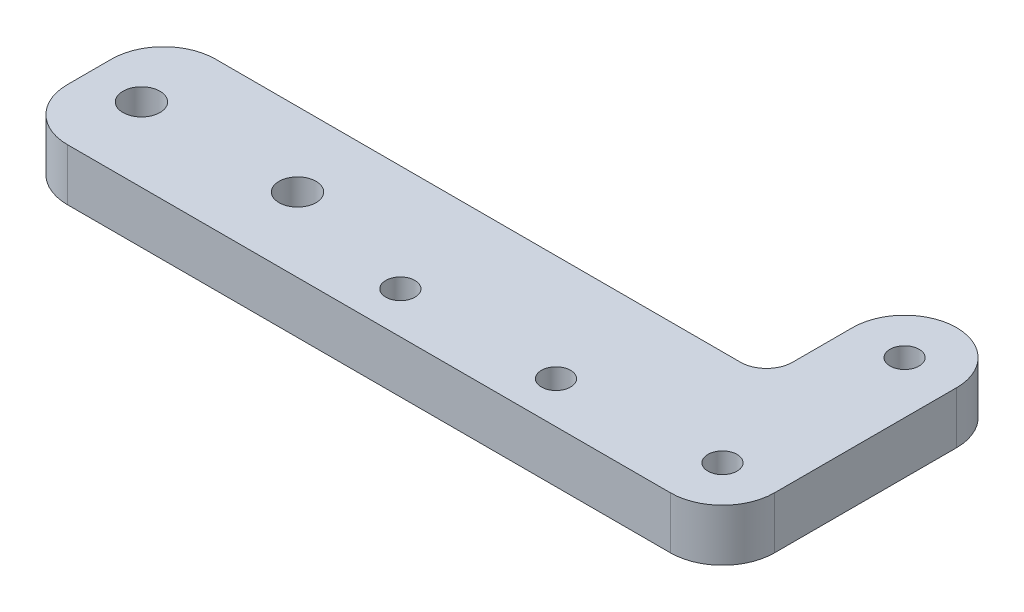
ISO-10303-21;
HEADER;
FILE_DESCRIPTION(('STEP AP214'),'2;1');
FILE_NAME('part.step','',(''),(''),'','','');
FILE_SCHEMA(('AUTOMOTIVE_DESIGN { 1 0 10303 214 1 1 1 1 }'));
ENDSEC;
DATA;
#1=APPLICATION_CONTEXT('core data for automotive mechanical design processes');
#2=APPLICATION_PROTOCOL_DEFINITION('international standard','automotive_design',2000,#1);
#3=PRODUCT_CONTEXT('',#1,'mechanical');
#4=PRODUCT('Part','Part','',(#3));
#5=PRODUCT_RELATED_PRODUCT_CATEGORY('part','',(#4));
#6=PRODUCT_DEFINITION_FORMATION('','',#4);
#7=PRODUCT_DEFINITION_CONTEXT('part definition',#1,'design');
#8=PRODUCT_DEFINITION('design','',#6,#7);
#9=PRODUCT_DEFINITION_SHAPE('','',#8);
#10=(LENGTH_UNIT() NAMED_UNIT(*) SI_UNIT(.MILLI.,.METRE.));
#11=(NAMED_UNIT(*) PLANE_ANGLE_UNIT() SI_UNIT($,.RADIAN.));
#12=(NAMED_UNIT(*) SI_UNIT($,.STERADIAN.) SOLID_ANGLE_UNIT());
#13=UNCERTAINTY_MEASURE_WITH_UNIT(LENGTH_MEASURE(1.E-05),#10,'distance_accuracy_value','');
#14=(GEOMETRIC_REPRESENTATION_CONTEXT(3) GLOBAL_UNCERTAINTY_ASSIGNED_CONTEXT((#13)) GLOBAL_UNIT_ASSIGNED_CONTEXT((#10,
#11,#12)) REPRESENTATION_CONTEXT('',''));
#15=CARTESIAN_POINT('',(0.,0.,0.));
#16=DIRECTION('',(0.,0.,1.));
#17=DIRECTION('',(1.,0.,0.));
#18=AXIS2_PLACEMENT_3D('',#15,#16,#17);
#19=CARTESIAN_POINT('',(6.2955830398848,3.175,-2.15598486383243));
#20=DIRECTION('',(0.,-1.,0.));
#21=DIRECTION('',(0.,0.,-1.));
#22=AXIS2_PLACEMENT_3D('',#19,#20,#21);
#23=PLANE('',#22);
#24=CARTESIAN_POINT('',(-16.2219169601152,3.175,3.95151513616758));
#25=DIRECTION('',(0.,1.,0.));
#26=DIRECTION('',(0.,0.,1.));
#27=AXIS2_PLACEMENT_3D('',#24,#25,#26);
#28=CIRCLE('',#27,1.1303);
#29=CARTESIAN_POINT('',(-16.2219169601152,3.175,5.08181513616757));
#30=VERTEX_POINT('',#29);
#31=EDGE_CURVE('E230',#30,#30,#28,.T.);
#32=ORIENTED_EDGE('',*,*,#31,.F.);
#33=EDGE_LOOP('',(#32));
#34=FACE_BOUND('',#33,.T.);
#35=CARTESIAN_POINT('',(11.0580830398848,3.175,-5.81598486383243));
#36=DIRECTION('',(0.,1.,0.));
#37=DIRECTION('',(0.,0.,1.));
#38=AXIS2_PLACEMENT_3D('',#35,#36,#37);
#39=CIRCLE('',#38,0.889000000000002);
#40=CARTESIAN_POINT('',(11.0580830398848,3.175,-4.92698486383243));
#41=VERTEX_POINT('',#40);
#42=EDGE_CURVE('E218',#41,#41,#39,.T.);
#43=ORIENTED_EDGE('',*,*,#42,.F.);
#44=EDGE_LOOP('',(#43));
#45=FACE_BOUND('',#44,.T.);
#46=CARTESIAN_POINT('',(-7.9669169601152,3.175,5.93151513616757));
#47=DIRECTION('',(0.,1.,0.));
#48=DIRECTION('',(0.,0.,1.));
#49=AXIS2_PLACEMENT_3D('',#46,#47,#48);
#50=CIRCLE('',#49,0.889);
#51=CARTESIAN_POINT('',(-7.9669169601152,3.175,6.82051513616757));
#52=VERTEX_POINT('',#51);
#53=EDGE_CURVE('E146',#52,#52,#50,.T.);
#54=ORIENTED_EDGE('',*,*,#53,.F.);
#55=EDGE_LOOP('',(#54));
#56=FACE_BOUND('',#55,.T.);
#57=CARTESIAN_POINT('',(6.2955830398848,3.175,-2.15598486383243));
#58=DIRECTION('',(0.,-1.,0.));
#59=DIRECTION('',(0.,0.,-1.));
#60=AXIS2_PLACEMENT_3D('',#57,#58,#59);
#61=CIRCLE('',#60,1.5875);
#62=CARTESIAN_POINT('',(7.8830830398848,3.175,-2.15598486383244));
#63=VERTEX_POINT('',#62);
#64=CARTESIAN_POINT('',(6.29558303988479,3.175,-0.568484863832431));
#65=VERTEX_POINT('',#64);
#66=EDGE_CURVE('E161',#63,#65,#61,.T.);
#67=ORIENTED_EDGE('',*,*,#66,.T.);
#68=DIRECTION('',(-1.,0.,0.));
#69=VECTOR('',#68,1.);
#70=CARTESIAN_POINT('',(-25.7469169601152,3.175,-0.568484863832431));
#71=LINE('',#70,#69);
#72=CARTESIAN_POINT('',(-25.7469169601152,3.175,-0.568484863832432));
#73=VERTEX_POINT('',#72);
#74=EDGE_CURVE('E99',#65,#73,#71,.T.);
#75=ORIENTED_EDGE('',*,*,#74,.T.);
#76=CARTESIAN_POINT('',(-25.7469169601152,3.175,2.60651513616757));
#77=DIRECTION('',(0.,1.,0.));
#78=DIRECTION('',(0.,0.,1.));
#79=AXIS2_PLACEMENT_3D('',#76,#77,#78);
#80=CIRCLE('',#79,3.175);
#81=CARTESIAN_POINT('',(-28.9219169601152,3.175,2.60651513616757));
#82=VERTEX_POINT('',#81);
#83=EDGE_CURVE('E182',#73,#82,#80,.T.);
#84=ORIENTED_EDGE('',*,*,#83,.T.);
#85=DIRECTION('',(0.,0.,1.));
#86=VECTOR('',#85,1.);
#87=CARTESIAN_POINT('',(-28.9219169601152,3.175,2.60651513616757));
#88=LINE('',#87,#86);
#89=CARTESIAN_POINT('',(-28.9219169601152,3.175,5.29651513616757));
#90=VERTEX_POINT('',#89);
#91=EDGE_CURVE('E201',#82,#90,#88,.T.);
#92=ORIENTED_EDGE('',*,*,#91,.T.);
#93=CARTESIAN_POINT('',(-25.7469169601152,3.175,5.29651513616757));
#94=DIRECTION('',(0.,1.,0.));
#95=DIRECTION('',(0.,0.,1.));
#96=AXIS2_PLACEMENT_3D('',#93,#94,#95);
#97=CIRCLE('',#96,3.175);
#98=CARTESIAN_POINT('',(-25.7469169601152,3.175,8.47151513616757));
#99=VERTEX_POINT('',#98);
#100=EDGE_CURVE('E198',#90,#99,#97,.T.);
#101=ORIENTED_EDGE('',*,*,#100,.T.);
#102=DIRECTION('',(1.,0.,0.));
#103=VECTOR('',#102,1.);
#104=CARTESIAN_POINT('',(-25.7469169601152,3.175,8.47151513616757));
#105=LINE('',#104,#103);
#106=CARTESIAN_POINT('',(11.0580830398848,3.175,8.47151513616757));
#107=VERTEX_POINT('',#106);
#108=EDGE_CURVE('E200',#99,#107,#105,.T.);
#109=ORIENTED_EDGE('',*,*,#108,.T.);
#110=CARTESIAN_POINT('',(11.0580830398848,3.175,5.29651513616757));
#111=DIRECTION('',(0.,1.,0.));
#112=DIRECTION('',(0.,0.,-1.));
#113=AXIS2_PLACEMENT_3D('',#110,#111,#112);
#114=CIRCLE('',#113,3.175);
#115=CARTESIAN_POINT('',(14.2330830398848,3.175,5.29651513616755));
#116=VERTEX_POINT('',#115);
#117=EDGE_CURVE('E124',#107,#116,#114,.T.);
#118=ORIENTED_EDGE('',*,*,#117,.T.);
#119=DIRECTION('',(0.,0.,-1.));
#120=VECTOR('',#119,1.);
#121=CARTESIAN_POINT('',(14.2330830398848,3.175,-5.81598486383243));
#122=LINE('',#121,#120);
#123=CARTESIAN_POINT('',(14.2330830398848,3.175,-5.81598486383243));
#124=VERTEX_POINT('',#123);
#125=EDGE_CURVE('E118',#116,#124,#122,.T.);
#126=ORIENTED_EDGE('',*,*,#125,.T.);
#127=CARTESIAN_POINT('',(11.0580830398848,3.175,-5.81598486383243));
#128=DIRECTION('',(0.,1.,0.));
#129=DIRECTION('',(0.,0.,1.));
#130=AXIS2_PLACEMENT_3D('',#127,#128,#129);
#131=CIRCLE('',#130,3.175);
#132=CARTESIAN_POINT('',(7.8830830398848,3.175,-5.81598486383243));
#133=VERTEX_POINT('',#132);
#134=EDGE_CURVE('E122',#124,#133,#131,.T.);
#135=ORIENTED_EDGE('',*,*,#134,.T.);
#136=DIRECTION('',(0.,0.,1.));
#137=VECTOR('',#136,1.);
#138=CARTESIAN_POINT('',(7.8830830398848,3.175,-5.81598486383243));
#139=LINE('',#138,#137);
#140=EDGE_CURVE('E50',#133,#63,#139,.T.);
#141=ORIENTED_EDGE('',*,*,#140,.T.);
#142=EDGE_LOOP('',(#67,#75,#84,#92,#101,#109,#118,#126,#135,#141));
#143=FACE_BOUND('',#142,.T.);
#144=CARTESIAN_POINT('',(1.5330830398848,3.175,5.93151513616757));
#145=DIRECTION('',(0.,1.,0.));
#146=DIRECTION('',(0.,0.,1.));
#147=AXIS2_PLACEMENT_3D('',#144,#145,#146);
#148=CIRCLE('',#147,0.888999999999999);
#149=CARTESIAN_POINT('',(1.5330830398848,3.175,6.82051513616757));
#150=VERTEX_POINT('',#149);
#151=EDGE_CURVE('E212',#150,#150,#148,.T.);
#152=ORIENTED_EDGE('',*,*,#151,.F.);
#153=EDGE_LOOP('',(#152));
#154=FACE_BOUND('',#153,.T.);
#155=CARTESIAN_POINT('',(-25.7469169601152,3.175,3.95151513616759));
#156=DIRECTION('',(0.,1.,0.));
#157=DIRECTION('',(0.,0.,1.));
#158=AXIS2_PLACEMENT_3D('',#155,#156,#157);
#159=CIRCLE('',#158,1.1303);
#160=CARTESIAN_POINT('',(-25.7469169601152,3.175,5.08181513616759));
#161=VERTEX_POINT('',#160);
#162=EDGE_CURVE('E224',#161,#161,#159,.T.);
#163=ORIENTED_EDGE('',*,*,#162,.F.);
#164=EDGE_LOOP('',(#163));
#165=FACE_BOUND('',#164,.T.);
#166=CARTESIAN_POINT('',(11.0580830398848,3.175,5.29651513616757));
#167=DIRECTION('',(0.,1.,0.));
#168=DIRECTION('',(0.,0.,1.));
#169=AXIS2_PLACEMENT_3D('',#166,#167,#168);
#170=CIRCLE('',#169,0.889000000000002);
#171=CARTESIAN_POINT('',(11.0580830398848,3.175,6.18551513616757));
#172=VERTEX_POINT('',#171);
#173=EDGE_CURVE('E236',#172,#172,#170,.T.);
#174=ORIENTED_EDGE('',*,*,#173,.F.);
#175=EDGE_LOOP('',(#174));
#176=FACE_BOUND('',#175,.T.);
#177=ADVANCED_FACE('F33',(#34,#45,#56,#143,#154,#165,#176),#23,.F.);
#178=CARTESIAN_POINT('',(6.2955830398848,0.,-2.15598486383243));
#179=DIRECTION('',(0.,-1.,0.));
#180=DIRECTION('',(0.,0.,-1.));
#181=AXIS2_PLACEMENT_3D('',#178,#179,#180);
#182=PLANE('',#181);
#183=CARTESIAN_POINT('',(-16.2219169601152,0.,3.95151513616758));
#184=DIRECTION('',(0.,1.,0.));
#185=DIRECTION('',(0.,0.,1.));
#186=AXIS2_PLACEMENT_3D('',#183,#184,#185);
#187=CIRCLE('',#186,1.1303);
#188=CARTESIAN_POINT('',(-16.2219169601152,0.,5.08181513616757));
#189=VERTEX_POINT('',#188);
#190=EDGE_CURVE('E233',#189,#189,#187,.T.);
#191=ORIENTED_EDGE('',*,*,#190,.T.);
#192=EDGE_LOOP('',(#191));
#193=FACE_BOUND('',#192,.T.);
#194=CARTESIAN_POINT('',(11.0580830398848,0.,-5.81598486383243));
#195=DIRECTION('',(0.,1.,0.));
#196=DIRECTION('',(0.,0.,1.));
#197=AXIS2_PLACEMENT_3D('',#194,#195,#196);
#198=CIRCLE('',#197,0.889000000000002);
#199=CARTESIAN_POINT('',(11.0580830398848,0.,-4.92698486383243));
#200=VERTEX_POINT('',#199);
#201=EDGE_CURVE('E221',#200,#200,#198,.T.);
#202=ORIENTED_EDGE('',*,*,#201,.T.);
#203=EDGE_LOOP('',(#202));
#204=FACE_BOUND('',#203,.T.);
#205=CARTESIAN_POINT('',(-7.9669169601152,0.,5.93151513616757));
#206=DIRECTION('',(0.,1.,0.));
#207=DIRECTION('',(0.,0.,1.));
#208=AXIS2_PLACEMENT_3D('',#205,#206,#207);
#209=CIRCLE('',#208,0.889);
#210=CARTESIAN_POINT('',(-7.9669169601152,0.,6.82051513616757));
#211=VERTEX_POINT('',#210);
#212=EDGE_CURVE('E209',#211,#211,#209,.T.);
#213=ORIENTED_EDGE('',*,*,#212,.T.);
#214=EDGE_LOOP('',(#213));
#215=FACE_BOUND('',#214,.T.);
#216=CARTESIAN_POINT('',(6.2955830398848,0.,-2.15598486383243));
#217=DIRECTION('',(0.,-1.,0.));
#218=DIRECTION('',(0.,0.,-1.));
#219=AXIS2_PLACEMENT_3D('',#216,#217,#218);
#220=CIRCLE('',#219,1.5875);
#221=CARTESIAN_POINT('',(7.8830830398848,0.,-2.15598486383244));
#222=VERTEX_POINT('',#221);
#223=CARTESIAN_POINT('',(6.29558303988479,0.,-0.568484863832431));
#224=VERTEX_POINT('',#223);
#225=EDGE_CURVE('E142',#222,#224,#220,.T.);
#226=ORIENTED_EDGE('',*,*,#225,.F.);
#227=DIRECTION('',(0.,0.,1.));
#228=VECTOR('',#227,1.);
#229=CARTESIAN_POINT('',(7.8830830398848,0.,-5.81598486383243));
#230=LINE('',#229,#228);
#231=CARTESIAN_POINT('',(7.8830830398848,0.,-5.81598486383243));
#232=VERTEX_POINT('',#231);
#233=EDGE_CURVE('E91',#232,#222,#230,.T.);
#234=ORIENTED_EDGE('',*,*,#233,.F.);
#235=CARTESIAN_POINT('',(11.0580830398848,0.,-5.81598486383243));
#236=DIRECTION('',(0.,1.,0.));
#237=DIRECTION('',(0.,0.,1.));
#238=AXIS2_PLACEMENT_3D('',#235,#236,#237);
#239=CIRCLE('',#238,3.175);
#240=CARTESIAN_POINT('',(14.2330830398848,0.,-5.81598486383243));
#241=VERTEX_POINT('',#240);
#242=EDGE_CURVE('E85',#241,#232,#239,.T.);
#243=ORIENTED_EDGE('',*,*,#242,.F.);
#244=DIRECTION('',(0.,0.,-1.));
#245=VECTOR('',#244,1.);
#246=CARTESIAN_POINT('',(14.2330830398848,0.,-5.81598486383243));
#247=LINE('',#246,#245);
#248=CARTESIAN_POINT('',(14.2330830398848,0.,5.29651513616755));
#249=VERTEX_POINT('',#248);
#250=EDGE_CURVE('E132',#249,#241,#247,.T.);
#251=ORIENTED_EDGE('',*,*,#250,.F.);
#252=CARTESIAN_POINT('',(11.0580830398848,0.,5.29651513616757));
#253=DIRECTION('',(0.,1.,0.));
#254=DIRECTION('',(0.,0.,-1.));
#255=AXIS2_PLACEMENT_3D('',#252,#253,#254);
#256=CIRCLE('',#255,3.175);
#257=CARTESIAN_POINT('',(11.0580830398848,0.,8.47151513616757));
#258=VERTEX_POINT('',#257);
#259=EDGE_CURVE('E156',#258,#249,#256,.T.);
#260=ORIENTED_EDGE('',*,*,#259,.F.);
#261=DIRECTION('',(1.,0.,0.));
#262=VECTOR('',#261,1.);
#263=CARTESIAN_POINT('',(-25.7469169601152,0.,8.47151513616757));
#264=LINE('',#263,#262);
#265=CARTESIAN_POINT('',(-25.7469169601152,0.,8.47151513616757));
#266=VERTEX_POINT('',#265);
#267=EDGE_CURVE('E154',#266,#258,#264,.T.);
#268=ORIENTED_EDGE('',*,*,#267,.F.);
#269=CARTESIAN_POINT('',(-25.7469169601152,0.,5.29651513616757));
#270=DIRECTION('',(0.,1.,0.));
#271=DIRECTION('',(0.,0.,1.));
#272=AXIS2_PLACEMENT_3D('',#269,#270,#271);
#273=CIRCLE('',#272,3.175);
#274=CARTESIAN_POINT('',(-28.9219169601152,0.,5.29651513616757));
#275=VERTEX_POINT('',#274);
#276=EDGE_CURVE('E152',#275,#266,#273,.T.);
#277=ORIENTED_EDGE('',*,*,#276,.F.);
#278=DIRECTION('',(0.,0.,1.));
#279=VECTOR('',#278,1.);
#280=CARTESIAN_POINT('',(-28.9219169601152,0.,2.60651513616757));
#281=LINE('',#280,#279);
#282=CARTESIAN_POINT('',(-28.9219169601152,0.,2.60651513616757));
#283=VERTEX_POINT('',#282);
#284=EDGE_CURVE('E150',#283,#275,#281,.T.);
#285=ORIENTED_EDGE('',*,*,#284,.F.);
#286=CARTESIAN_POINT('',(-25.7469169601152,0.,2.60651513616757));
#287=DIRECTION('',(0.,1.,0.));
#288=DIRECTION('',(0.,0.,1.));
#289=AXIS2_PLACEMENT_3D('',#286,#287,#288);
#290=CIRCLE('',#289,3.175);
#291=CARTESIAN_POINT('',(-25.7469169601152,0.,-0.568484863832432));
#292=VERTEX_POINT('',#291);
#293=EDGE_CURVE('E148',#292,#283,#290,.T.);
#294=ORIENTED_EDGE('',*,*,#293,.F.);
#295=DIRECTION('',(-1.,0.,0.));
#296=VECTOR('',#295,1.);
#297=CARTESIAN_POINT('',(-25.7469169601152,0.,-0.568484863832431));
#298=LINE('',#297,#296);
#299=EDGE_CURVE('E145',#224,#292,#298,.T.);
#300=ORIENTED_EDGE('',*,*,#299,.F.);
#301=EDGE_LOOP('',(#226,#234,#243,#251,#260,#268,#277,#285,#294,#300));
#302=FACE_BOUND('',#301,.T.);
#303=CARTESIAN_POINT('',(1.5330830398848,0.,5.93151513616757));
#304=DIRECTION('',(0.,1.,0.));
#305=DIRECTION('',(0.,0.,1.));
#306=AXIS2_PLACEMENT_3D('',#303,#304,#305);
#307=CIRCLE('',#306,0.888999999999999);
#308=CARTESIAN_POINT('',(1.5330830398848,0.,6.82051513616757));
#309=VERTEX_POINT('',#308);
#310=EDGE_CURVE('E215',#309,#309,#307,.T.);
#311=ORIENTED_EDGE('',*,*,#310,.T.);
#312=EDGE_LOOP('',(#311));
#313=FACE_BOUND('',#312,.T.);
#314=CARTESIAN_POINT('',(-25.7469169601152,0.,3.95151513616759));
#315=DIRECTION('',(0.,1.,0.));
#316=DIRECTION('',(0.,0.,1.));
#317=AXIS2_PLACEMENT_3D('',#314,#315,#316);
#318=CIRCLE('',#317,1.1303);
#319=CARTESIAN_POINT('',(-25.7469169601152,0.,5.08181513616759));
#320=VERTEX_POINT('',#319);
#321=EDGE_CURVE('E227',#320,#320,#318,.T.);
#322=ORIENTED_EDGE('',*,*,#321,.T.);
#323=EDGE_LOOP('',(#322));
#324=FACE_BOUND('',#323,.T.);
#325=CARTESIAN_POINT('',(11.0580830398848,0.,5.29651513616757));
#326=DIRECTION('',(0.,1.,0.));
#327=DIRECTION('',(0.,0.,1.));
#328=AXIS2_PLACEMENT_3D('',#325,#326,#327);
#329=CIRCLE('',#328,0.889000000000002);
#330=CARTESIAN_POINT('',(11.0580830398848,0.,6.18551513616757));
#331=VERTEX_POINT('',#330);
#332=EDGE_CURVE('E239',#331,#331,#329,.T.);
#333=ORIENTED_EDGE('',*,*,#332,.T.);
#334=EDGE_LOOP('',(#333));
#335=FACE_BOUND('',#334,.T.);
#336=ADVANCED_FACE('F186',(#193,#204,#215,#302,#313,#324,#335),#182,.T.);
#337=CARTESIAN_POINT('',(6.2955830398848,3.175,-2.15598486383243));
#338=DIRECTION('',(0.,-1.,0.));
#339=DIRECTION('',(0.,0.,-1.));
#340=AXIS2_PLACEMENT_3D('',#337,#338,#339);
#341=CYLINDRICAL_SURFACE('',#340,1.5875);
#342=ORIENTED_EDGE('',*,*,#225,.T.);
#343=DIRECTION('',(0.,-1.,0.));
#344=VECTOR('',#343,1.);
#345=CARTESIAN_POINT('',(6.29558303988479,3.175,-0.568484863832431));
#346=LINE('',#345,#344);
#347=EDGE_CURVE('E11',#65,#224,#346,.T.);
#348=ORIENTED_EDGE('',*,*,#347,.F.);
#349=ORIENTED_EDGE('',*,*,#66,.F.);
#350=DIRECTION('',(0.,-1.,0.));
#351=VECTOR('',#350,1.);
#352=CARTESIAN_POINT('',(7.8830830398848,3.175,-2.15598486383244));
#353=LINE('',#352,#351);
#354=EDGE_CURVE('E138',#63,#222,#353,.T.);
#355=ORIENTED_EDGE('',*,*,#354,.T.);
#356=EDGE_LOOP('',(#342,#348,#349,#355));
#357=FACE_BOUND('',#356,.T.);
#358=ADVANCED_FACE('F35',(#357),#341,.F.);
#359=CARTESIAN_POINT('',(-25.7469169601152,3.175,-0.568484863832431));
#360=DIRECTION('',(0.,0.,1.));
#361=DIRECTION('',(1.,0.,0.));
#362=AXIS2_PLACEMENT_3D('',#359,#360,#361);
#363=PLANE('',#362);
#364=ORIENTED_EDGE('',*,*,#299,.T.);
#365=DIRECTION('',(0.,-1.,0.));
#366=VECTOR('',#365,1.);
#367=CARTESIAN_POINT('',(-25.7469169601152,3.175,-0.568484863832432));
#368=LINE('',#367,#366);
#369=EDGE_CURVE('E42',#73,#292,#368,.T.);
#370=ORIENTED_EDGE('',*,*,#369,.F.);
#371=ORIENTED_EDGE('',*,*,#74,.F.);
#372=ORIENTED_EDGE('',*,*,#347,.T.);
#373=EDGE_LOOP('',(#364,#370,#371,#372));
#374=FACE_BOUND('',#373,.T.);
#375=ADVANCED_FACE('F282',(#374),#363,.F.);
#376=CARTESIAN_POINT('',(-25.7469169601152,3.175,2.60651513616757));
#377=DIRECTION('',(0.,-1.,0.));
#378=DIRECTION('',(0.,0.,-1.));
#379=AXIS2_PLACEMENT_3D('',#376,#377,#378);
#380=CYLINDRICAL_SURFACE('',#379,3.175);
#381=ORIENTED_EDGE('',*,*,#293,.T.);
#382=DIRECTION('',(0.,-1.,0.));
#383=VECTOR('',#382,1.);
#384=CARTESIAN_POINT('',(-28.9219169601152,3.175,2.60651513616757));
#385=LINE('',#384,#383);
#386=EDGE_CURVE('E174',#82,#283,#385,.T.);
#387=ORIENTED_EDGE('',*,*,#386,.F.);
#388=ORIENTED_EDGE('',*,*,#83,.F.);
#389=ORIENTED_EDGE('',*,*,#369,.T.);
#390=EDGE_LOOP('',(#381,#387,#388,#389));
#391=FACE_BOUND('',#390,.T.);
#392=ADVANCED_FACE('F180',(#391),#380,.T.);
#393=CARTESIAN_POINT('',(-28.9219169601152,3.175,2.60651513616757));
#394=DIRECTION('',(1.,0.,0.));
#395=DIRECTION('',(0.,0.,-1.));
#396=AXIS2_PLACEMENT_3D('',#393,#394,#395);
#397=PLANE('',#396);
#398=ORIENTED_EDGE('',*,*,#284,.T.);
#399=DIRECTION('',(0.,-1.,0.));
#400=VECTOR('',#399,1.);
#401=CARTESIAN_POINT('',(-28.9219169601152,3.175,5.29651513616757));
#402=LINE('',#401,#400);
#403=EDGE_CURVE('E171',#90,#275,#402,.T.);
#404=ORIENTED_EDGE('',*,*,#403,.F.);
#405=ORIENTED_EDGE('',*,*,#91,.F.);
#406=ORIENTED_EDGE('',*,*,#386,.T.);
#407=EDGE_LOOP('',(#398,#404,#405,#406));
#408=FACE_BOUND('',#407,.T.);
#409=ADVANCED_FACE('F192',(#408),#397,.F.);
#410=CARTESIAN_POINT('',(-25.7469169601152,3.175,5.29651513616757));
#411=DIRECTION('',(0.,-1.,0.));
#412=DIRECTION('',(0.,0.,-1.));
#413=AXIS2_PLACEMENT_3D('',#410,#411,#412);
#414=CYLINDRICAL_SURFACE('',#413,3.175);
#415=ORIENTED_EDGE('',*,*,#276,.T.);
#416=DIRECTION('',(0.,-1.,0.));
#417=VECTOR('',#416,1.);
#418=CARTESIAN_POINT('',(-25.7469169601152,3.175,8.47151513616757));
#419=LINE('',#418,#417);
#420=EDGE_CURVE('E168',#99,#266,#419,.T.);
#421=ORIENTED_EDGE('',*,*,#420,.F.);
#422=ORIENTED_EDGE('',*,*,#100,.F.);
#423=ORIENTED_EDGE('',*,*,#403,.T.);
#424=EDGE_LOOP('',(#415,#421,#422,#423));
#425=FACE_BOUND('',#424,.T.);
#426=ADVANCED_FACE('F196',(#425),#414,.T.);
#427=CARTESIAN_POINT('',(-25.7469169601152,3.175,8.47151513616757));
#428=DIRECTION('',(0.,0.,-1.));
#429=DIRECTION('',(-1.,0.,0.));
#430=AXIS2_PLACEMENT_3D('',#427,#428,#429);
#431=PLANE('',#430);
#432=ORIENTED_EDGE('',*,*,#267,.T.);
#433=DIRECTION('',(0.,-1.,0.));
#434=VECTOR('',#433,1.);
#435=CARTESIAN_POINT('',(11.0580830398848,3.175,8.47151513616757));
#436=LINE('',#435,#434);
#437=EDGE_CURVE('E165',#107,#258,#436,.T.);
#438=ORIENTED_EDGE('',*,*,#437,.F.);
#439=ORIENTED_EDGE('',*,*,#108,.F.);
#440=ORIENTED_EDGE('',*,*,#420,.T.);
#441=EDGE_LOOP('',(#432,#438,#439,#440));
#442=FACE_BOUND('',#441,.T.);
#443=ADVANCED_FACE('F272',(#442),#431,.F.);
#444=CARTESIAN_POINT('',(11.0580830398848,3.175,5.29651513616757));
#445=DIRECTION('',(0.,-1.,0.));
#446=DIRECTION('',(0.,0.,-1.));
#447=AXIS2_PLACEMENT_3D('',#444,#445,#446);
#448=CYLINDRICAL_SURFACE('',#447,3.175);
#449=ORIENTED_EDGE('',*,*,#259,.T.);
#450=DIRECTION('',(0.,-1.,0.));
#451=VECTOR('',#450,1.);
#452=CARTESIAN_POINT('',(14.2330830398848,3.175,5.29651513616755));
#453=LINE('',#452,#451);
#454=EDGE_CURVE('E133',#116,#249,#453,.T.);
#455=ORIENTED_EDGE('',*,*,#454,.F.);
#456=ORIENTED_EDGE('',*,*,#117,.F.);
#457=ORIENTED_EDGE('',*,*,#437,.T.);
#458=EDGE_LOOP('',(#449,#455,#456,#457));
#459=FACE_BOUND('',#458,.T.);
#460=ADVANCED_FACE('F269',(#459),#448,.T.);
#461=CARTESIAN_POINT('',(14.2330830398848,3.175,-5.81598486383243));
#462=DIRECTION('',(-1.,0.,0.));
#463=DIRECTION('',(0.,0.,1.));
#464=AXIS2_PLACEMENT_3D('',#461,#462,#463);
#465=PLANE('',#464);
#466=ORIENTED_EDGE('',*,*,#250,.T.);
#467=DIRECTION('',(0.,-1.,0.));
#468=VECTOR('',#467,1.);
#469=CARTESIAN_POINT('',(14.2330830398848,3.175,-5.81598486383243));
#470=LINE('',#469,#468);
#471=EDGE_CURVE('E129',#124,#241,#470,.T.);
#472=ORIENTED_EDGE('',*,*,#471,.F.);
#473=ORIENTED_EDGE('',*,*,#125,.F.);
#474=ORIENTED_EDGE('',*,*,#454,.T.);
#475=EDGE_LOOP('',(#466,#472,#473,#474));
#476=FACE_BOUND('',#475,.T.);
#477=ADVANCED_FACE('F130',(#476),#465,.F.);
#478=CARTESIAN_POINT('',(11.0580830398848,3.175,-5.81598486383243));
#479=DIRECTION('',(0.,-1.,0.));
#480=DIRECTION('',(0.,0.,-1.));
#481=AXIS2_PLACEMENT_3D('',#478,#479,#480);
#482=CYLINDRICAL_SURFACE('',#481,3.175);
#483=ORIENTED_EDGE('',*,*,#242,.T.);
#484=DIRECTION('',(0.,-1.,0.));
#485=VECTOR('',#484,1.);
#486=CARTESIAN_POINT('',(7.8830830398848,3.175,-5.81598486383243));
#487=LINE('',#486,#485);
#488=EDGE_CURVE('E134',#133,#232,#487,.T.);
#489=ORIENTED_EDGE('',*,*,#488,.F.);
#490=ORIENTED_EDGE('',*,*,#134,.F.);
#491=ORIENTED_EDGE('',*,*,#471,.T.);
#492=EDGE_LOOP('',(#483,#489,#490,#491));
#493=FACE_BOUND('',#492,.T.);
#494=ADVANCED_FACE('F136',(#493),#482,.T.);
#495=CARTESIAN_POINT('',(7.8830830398848,3.175,-5.81598486383243));
#496=DIRECTION('',(1.,0.,0.));
#497=DIRECTION('',(0.,0.,-1.));
#498=AXIS2_PLACEMENT_3D('',#495,#496,#497);
#499=PLANE('',#498);
#500=ORIENTED_EDGE('',*,*,#233,.T.);
#501=ORIENTED_EDGE('',*,*,#354,.F.);
#502=ORIENTED_EDGE('',*,*,#140,.F.);
#503=ORIENTED_EDGE('',*,*,#488,.T.);
#504=EDGE_LOOP('',(#500,#501,#502,#503));
#505=FACE_BOUND('',#504,.T.);
#506=ADVANCED_FACE('F262',(#505),#499,.F.);
#507=CARTESIAN_POINT('',(-7.9669169601152,3.175,5.93151513616757));
#508=DIRECTION('',(0.,-1.,0.));
#509=DIRECTION('',(0.,0.,-1.));
#510=AXIS2_PLACEMENT_3D('',#507,#508,#509);
#511=CYLINDRICAL_SURFACE('',#510,0.889);
#512=ORIENTED_EDGE('',*,*,#53,.T.);
#513=EDGE_LOOP('',(#512));
#514=FACE_BOUND('',#513,.T.);
#515=ORIENTED_EDGE('',*,*,#212,.F.);
#516=EDGE_LOOP('',(#515));
#517=FACE_BOUND('',#516,.T.);
#518=ADVANCED_FACE('F259',(#514,#517),#511,.F.);
#519=CARTESIAN_POINT('',(1.5330830398848,3.175,5.93151513616757));
#520=DIRECTION('',(0.,-1.,0.));
#521=DIRECTION('',(0.,0.,-1.));
#522=AXIS2_PLACEMENT_3D('',#519,#520,#521);
#523=CYLINDRICAL_SURFACE('',#522,0.888999999999999);
#524=ORIENTED_EDGE('',*,*,#151,.T.);
#525=EDGE_LOOP('',(#524));
#526=FACE_BOUND('',#525,.T.);
#527=ORIENTED_EDGE('',*,*,#310,.F.);
#528=EDGE_LOOP('',(#527));
#529=FACE_BOUND('',#528,.T.);
#530=ADVANCED_FACE('F358',(#526,#529),#523,.F.);
#531=CARTESIAN_POINT('',(11.0580830398848,3.175,-5.81598486383243));
#532=DIRECTION('',(0.,-1.,0.));
#533=DIRECTION('',(0.,0.,-1.));
#534=AXIS2_PLACEMENT_3D('',#531,#532,#533);
#535=CYLINDRICAL_SURFACE('',#534,0.889000000000002);
#536=ORIENTED_EDGE('',*,*,#42,.T.);
#537=EDGE_LOOP('',(#536));
#538=FACE_BOUND('',#537,.T.);
#539=ORIENTED_EDGE('',*,*,#201,.F.);
#540=EDGE_LOOP('',(#539));
#541=FACE_BOUND('',#540,.T.);
#542=ADVANCED_FACE('F366',(#538,#541),#535,.F.);
#543=CARTESIAN_POINT('',(-25.7469169601152,3.175,3.95151513616759));
#544=DIRECTION('',(0.,-1.,0.));
#545=DIRECTION('',(0.,0.,-1.));
#546=AXIS2_PLACEMENT_3D('',#543,#544,#545);
#547=CYLINDRICAL_SURFACE('',#546,1.1303);
#548=ORIENTED_EDGE('',*,*,#162,.T.);
#549=EDGE_LOOP('',(#548));
#550=FACE_BOUND('',#549,.T.);
#551=ORIENTED_EDGE('',*,*,#321,.F.);
#552=EDGE_LOOP('',(#551));
#553=FACE_BOUND('',#552,.T.);
#554=ADVANCED_FACE('F374',(#550,#553),#547,.F.);
#555=CARTESIAN_POINT('',(-16.2219169601152,3.175,3.95151513616758));
#556=DIRECTION('',(0.,-1.,0.));
#557=DIRECTION('',(0.,0.,-1.));
#558=AXIS2_PLACEMENT_3D('',#555,#556,#557);
#559=CYLINDRICAL_SURFACE('',#558,1.1303);
#560=ORIENTED_EDGE('',*,*,#31,.T.);
#561=EDGE_LOOP('',(#560));
#562=FACE_BOUND('',#561,.T.);
#563=ORIENTED_EDGE('',*,*,#190,.F.);
#564=EDGE_LOOP('',(#563));
#565=FACE_BOUND('',#564,.T.);
#566=ADVANCED_FACE('F383',(#562,#565),#559,.F.);
#567=CARTESIAN_POINT('',(11.0580830398848,3.175,5.29651513616757));
#568=DIRECTION('',(0.,-1.,0.));
#569=DIRECTION('',(0.,0.,-1.));
#570=AXIS2_PLACEMENT_3D('',#567,#568,#569);
#571=CYLINDRICAL_SURFACE('',#570,0.889000000000002);
#572=ORIENTED_EDGE('',*,*,#173,.T.);
#573=EDGE_LOOP('',(#572));
#574=FACE_BOUND('',#573,.T.);
#575=ORIENTED_EDGE('',*,*,#332,.F.);
#576=EDGE_LOOP('',(#575));
#577=FACE_BOUND('',#576,.T.);
#578=ADVANCED_FACE('F245',(#574,#577),#571,.F.);
#579=CLOSED_SHELL('',(#177,#336,#358,#375,#392,#409,#426,#443,#460,#477,#494,#506,#518,#530,
#542,#554,#566,#578));
#580=MANIFOLD_SOLID_BREP('B2',#579);
#581=ADVANCED_BREP_SHAPE_REPRESENTATION('',(#18,#580),#14);
#582=SHAPE_DEFINITION_REPRESENTATION(#9,#581);
ENDSEC;
END-ISO-10303-21;
